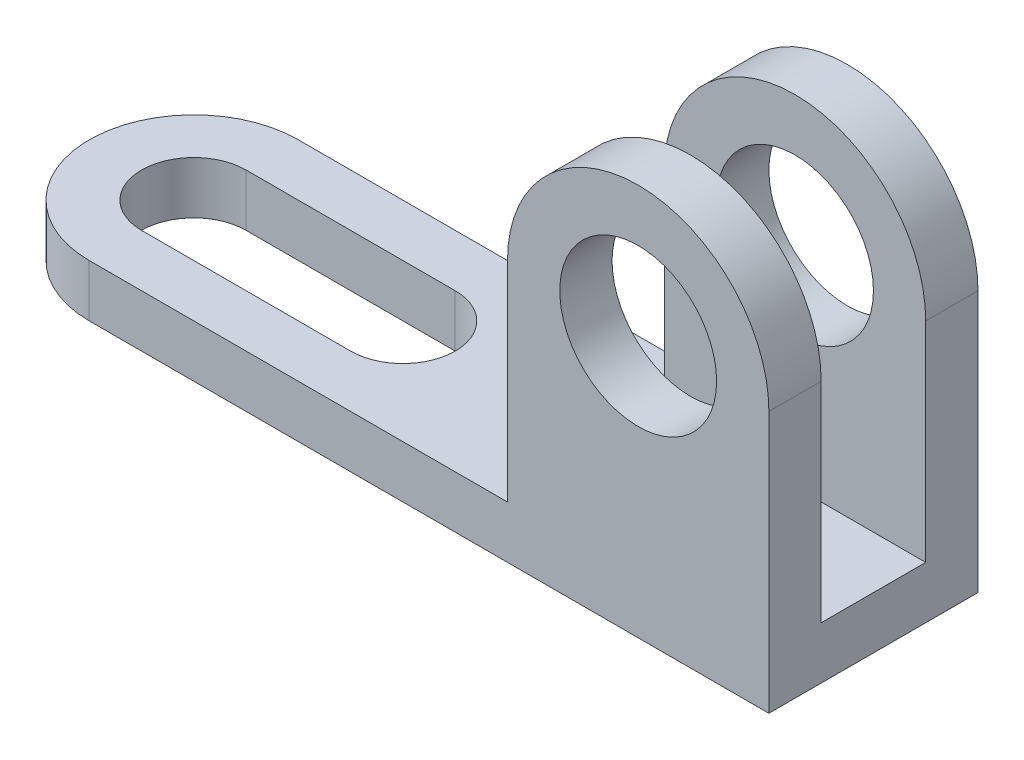
ISO-10303-21;
HEADER;
FILE_DESCRIPTION(('STEP AP214'),'2;1');
FILE_NAME('part.step','',(''),(''),'','','');
FILE_SCHEMA(('AUTOMOTIVE_DESIGN { 1 0 10303 214 1 1 1 1 }'));
ENDSEC;
DATA;
#1=APPLICATION_CONTEXT('core data for automotive mechanical design processes');
#2=APPLICATION_PROTOCOL_DEFINITION('international standard','automotive_design',2000,#1);
#3=PRODUCT_CONTEXT('',#1,'mechanical');
#4=PRODUCT('Part','Part','',(#3));
#5=PRODUCT_RELATED_PRODUCT_CATEGORY('part','',(#4));
#6=PRODUCT_DEFINITION_FORMATION('','',#4);
#7=PRODUCT_DEFINITION_CONTEXT('part definition',#1,'design');
#8=PRODUCT_DEFINITION('design','',#6,#7);
#9=PRODUCT_DEFINITION_SHAPE('','',#8);
#10=(LENGTH_UNIT() NAMED_UNIT(*) SI_UNIT(.MILLI.,.METRE.));
#11=(NAMED_UNIT(*) PLANE_ANGLE_UNIT() SI_UNIT($,.RADIAN.));
#12=(NAMED_UNIT(*) SI_UNIT($,.STERADIAN.) SOLID_ANGLE_UNIT());
#13=UNCERTAINTY_MEASURE_WITH_UNIT(LENGTH_MEASURE(1.E-05),#10,'distance_accuracy_value','');
#14=(GEOMETRIC_REPRESENTATION_CONTEXT(3) GLOBAL_UNCERTAINTY_ASSIGNED_CONTEXT((#13)) GLOBAL_UNIT_ASSIGNED_CONTEXT((#10,
#11,#12)) REPRESENTATION_CONTEXT('',''));
#15=CARTESIAN_POINT('',(0.,0.,0.));
#16=DIRECTION('',(0.,0.,1.));
#17=DIRECTION('',(1.,0.,0.));
#18=AXIS2_PLACEMENT_3D('',#15,#16,#17);
#19=CARTESIAN_POINT('',(0.,10.,-20.));
#20=DIRECTION('',(0.,0.,-1.));
#21=DIRECTION('',(-1.,0.,0.));
#22=AXIS2_PLACEMENT_3D('',#19,#20,#21);
#23=PLANE('',#22);
#24=CARTESIAN_POINT('',(40.,50.,-20.));
#25=DIRECTION('',(0.,0.,-1.));
#26=DIRECTION('',(-1.,0.,0.));
#27=AXIS2_PLACEMENT_3D('',#24,#25,#26);
#28=CIRCLE('',#27,15.);
#29=CARTESIAN_POINT('',(25.,50.,-20.));
#30=VERTEX_POINT('',#29);
#31=EDGE_CURVE('E343',#30,#30,#28,.F.);
#32=ORIENTED_EDGE('',*,*,#31,.T.);
#33=EDGE_LOOP('',(#32));
#34=FACE_BOUND('',#33,.T.);
#35=DIRECTION('',(0.,1.,0.));
#36=VECTOR('',#35,1.);
#37=CARTESIAN_POINT('',(15.,-50.9901951359279,-20.));
#38=LINE('',#37,#36);
#39=CARTESIAN_POINT('',(15.,10.,-20.));
#40=VERTEX_POINT('',#39);
#41=CARTESIAN_POINT('',(15.,50.,-20.));
#42=VERTEX_POINT('',#41);
#43=EDGE_CURVE('E165',#40,#42,#38,.T.);
#44=ORIENTED_EDGE('',*,*,#43,.T.);
#45=CARTESIAN_POINT('',(40.,50.,-20.));
#46=DIRECTION('',(0.,0.,-1.));
#47=DIRECTION('',(-1.,0.,0.));
#48=AXIS2_PLACEMENT_3D('',#45,#46,#47);
#49=CIRCLE('',#48,25.);
#50=CARTESIAN_POINT('',(65.,50.,-20.));
#51=VERTEX_POINT('',#50);
#52=EDGE_CURVE('E356',#42,#51,#49,.T.);
#53=ORIENTED_EDGE('',*,*,#52,.T.);
#54=DIRECTION('',(0.,1.,0.));
#55=VECTOR('',#54,1.);
#56=CARTESIAN_POINT('',(65.,-50.9901951359279,-20.));
#57=LINE('',#56,#55);
#58=CARTESIAN_POINT('',(65.,0.,-20.));
#59=VERTEX_POINT('',#58);
#60=EDGE_CURVE('E159',#59,#51,#57,.T.);
#61=ORIENTED_EDGE('',*,*,#60,.F.);
#62=DIRECTION('',(1.,0.,0.));
#63=VECTOR('',#62,1.);
#64=CARTESIAN_POINT('',(0.,0.,-20.));
#65=LINE('',#64,#63);
#66=CARTESIAN_POINT('',(-65.,0.,-20.));
#67=VERTEX_POINT('',#66);
#68=EDGE_CURVE('E244',#67,#59,#65,.T.);
#69=ORIENTED_EDGE('',*,*,#68,.F.);
#70=DIRECTION('',(0.,-1.,0.));
#71=VECTOR('',#70,1.);
#72=CARTESIAN_POINT('',(-65.,10.,-20.));
#73=LINE('',#72,#71);
#74=CARTESIAN_POINT('',(-65.,10.,-20.));
#75=VERTEX_POINT('',#74);
#76=EDGE_CURVE('E11',#75,#67,#73,.T.);
#77=ORIENTED_EDGE('',*,*,#76,.F.);
#78=DIRECTION('',(1.,0.,0.));
#79=VECTOR('',#78,1.);
#80=CARTESIAN_POINT('',(0.,10.,-20.));
#81=LINE('',#80,#79);
#82=EDGE_CURVE('E210',#75,#40,#81,.T.);
#83=ORIENTED_EDGE('',*,*,#82,.T.);
#84=EDGE_LOOP('',(#44,#53,#61,#69,#77,#83));
#85=FACE_BOUND('',#84,.T.);
#86=ADVANCED_FACE('F43',(#34,#85),#23,.T.);
#87=CARTESIAN_POINT('',(-65.,10.,0.));
#88=DIRECTION('',(0.,-1.,0.));
#89=DIRECTION('',(0.,0.,-1.));
#90=AXIS2_PLACEMENT_3D('',#87,#88,#89);
#91=CYLINDRICAL_SURFACE('',#90,20.);
#92=CARTESIAN_POINT('',(-65.,0.,0.));
#93=DIRECTION('',(0.,1.,0.));
#94=DIRECTION('',(0.,0.,1.));
#95=AXIS2_PLACEMENT_3D('',#92,#93,#94);
#96=CIRCLE('',#95,20.);
#97=CARTESIAN_POINT('',(-65.,0.,20.));
#98=VERTEX_POINT('',#97);
#99=EDGE_CURVE('E248',#67,#98,#96,.T.);
#100=ORIENTED_EDGE('',*,*,#99,.T.);
#101=DIRECTION('',(0.,-1.,0.));
#102=VECTOR('',#101,1.);
#103=CARTESIAN_POINT('',(-65.,10.,20.));
#104=LINE('',#103,#102);
#105=CARTESIAN_POINT('',(-65.,10.,20.));
#106=VERTEX_POINT('',#105);
#107=EDGE_CURVE('E54',#106,#98,#104,.T.);
#108=ORIENTED_EDGE('',*,*,#107,.F.);
#109=CARTESIAN_POINT('',(-65.,10.,0.));
#110=DIRECTION('',(0.,1.,0.));
#111=DIRECTION('',(0.,0.,1.));
#112=AXIS2_PLACEMENT_3D('',#109,#110,#111);
#113=CIRCLE('',#112,20.);
#114=EDGE_CURVE('E213',#75,#106,#113,.T.);
#115=ORIENTED_EDGE('',*,*,#114,.F.);
#116=ORIENTED_EDGE('',*,*,#76,.T.);
#117=EDGE_LOOP('',(#100,#108,#115,#116));
#118=FACE_BOUND('',#117,.T.);
#119=ADVANCED_FACE('F291',(#118),#91,.T.);
#120=CARTESIAN_POINT('',(0.,10.,20.));
#121=DIRECTION('',(0.,0.,-1.));
#122=DIRECTION('',(-1.,0.,0.));
#123=AXIS2_PLACEMENT_3D('',#120,#121,#122);
#124=PLANE('',#123);
#125=CARTESIAN_POINT('',(40.,50.,20.));
#126=DIRECTION('',(0.,0.,1.));
#127=DIRECTION('',(1.,0.,0.));
#128=AXIS2_PLACEMENT_3D('',#125,#126,#127);
#129=CIRCLE('',#128,15.);
#130=CARTESIAN_POINT('',(55.,50.,20.));
#131=VERTEX_POINT('',#130);
#132=EDGE_CURVE('E345',#131,#131,#129,.T.);
#133=ORIENTED_EDGE('',*,*,#132,.F.);
#134=EDGE_LOOP('',(#133));
#135=FACE_BOUND('',#134,.T.);
#136=DIRECTION('',(0.,1.,0.));
#137=VECTOR('',#136,1.);
#138=CARTESIAN_POINT('',(65.,-50.9901951359279,20.));
#139=LINE('',#138,#137);
#140=CARTESIAN_POINT('',(65.,0.,20.));
#141=VERTEX_POINT('',#140);
#142=CARTESIAN_POINT('',(65.,50.,20.));
#143=VERTEX_POINT('',#142);
#144=EDGE_CURVE('E179',#141,#143,#139,.T.);
#145=ORIENTED_EDGE('',*,*,#144,.T.);
#146=CARTESIAN_POINT('',(40.,50.,20.));
#147=DIRECTION('',(0.,0.,1.));
#148=DIRECTION('',(1.,0.,0.));
#149=AXIS2_PLACEMENT_3D('',#146,#147,#148);
#150=CIRCLE('',#149,25.);
#151=CARTESIAN_POINT('',(15.,50.,20.));
#152=VERTEX_POINT('',#151);
#153=EDGE_CURVE('E363',#143,#152,#150,.T.);
#154=ORIENTED_EDGE('',*,*,#153,.T.);
#155=DIRECTION('',(0.,1.,0.));
#156=VECTOR('',#155,1.);
#157=CARTESIAN_POINT('',(15.,-50.9901951359279,20.));
#158=LINE('',#157,#156);
#159=CARTESIAN_POINT('',(15.,10.,20.));
#160=VERTEX_POINT('',#159);
#161=EDGE_CURVE('E180',#160,#152,#158,.T.);
#162=ORIENTED_EDGE('',*,*,#161,.F.);
#163=DIRECTION('',(1.,0.,0.));
#164=VECTOR('',#163,1.);
#165=CARTESIAN_POINT('',(0.,10.,20.));
#166=LINE('',#165,#164);
#167=EDGE_CURVE('E217',#106,#160,#166,.T.);
#168=ORIENTED_EDGE('',*,*,#167,.F.);
#169=ORIENTED_EDGE('',*,*,#107,.T.);
#170=DIRECTION('',(1.,0.,0.));
#171=VECTOR('',#170,1.);
#172=CARTESIAN_POINT('',(0.,0.,20.));
#173=LINE('',#172,#171);
#174=EDGE_CURVE('E92',#98,#141,#173,.T.);
#175=ORIENTED_EDGE('',*,*,#174,.T.);
#176=EDGE_LOOP('',(#145,#154,#162,#168,#169,#175));
#177=FACE_BOUND('',#176,.T.);
#178=ADVANCED_FACE('F296',(#135,#177),#124,.F.);
#179=CARTESIAN_POINT('',(65.,10.,0.));
#180=DIRECTION('',(1.,0.,0.));
#181=DIRECTION('',(0.,0.,-1.));
#182=AXIS2_PLACEMENT_3D('',#179,#180,#181);
#183=PLANE('',#182);
#184=DIRECTION('',(0.,0.,1.));
#185=VECTOR('',#184,1.);
#186=CARTESIAN_POINT('',(65.,0.,0.));
#187=LINE('',#186,#185);
#188=EDGE_CURVE('E199',#59,#141,#187,.T.);
#189=ORIENTED_EDGE('',*,*,#188,.F.);
#190=ORIENTED_EDGE('',*,*,#60,.T.);
#191=DIRECTION('',(0.,0.,-1.));
#192=VECTOR('',#191,1.);
#193=CARTESIAN_POINT('',(65.,50.,-10.));
#194=LINE('',#193,#192);
#195=CARTESIAN_POINT('',(65.,50.,-10.));
#196=VERTEX_POINT('',#195);
#197=EDGE_CURVE('E156',#196,#51,#194,.T.);
#198=ORIENTED_EDGE('',*,*,#197,.F.);
#199=DIRECTION('',(0.,1.,0.));
#200=VECTOR('',#199,1.);
#201=CARTESIAN_POINT('',(65.,-50.9901951359279,-10.));
#202=LINE('',#201,#200);
#203=CARTESIAN_POINT('',(65.,10.,-10.));
#204=VERTEX_POINT('',#203);
#205=EDGE_CURVE('E146',#204,#196,#202,.T.);
#206=ORIENTED_EDGE('',*,*,#205,.F.);
#207=DIRECTION('',(0.,0.,1.));
#208=VECTOR('',#207,1.);
#209=CARTESIAN_POINT('',(65.,10.,0.));
#210=LINE('',#209,#208);
#211=CARTESIAN_POINT('',(65.,10.,10.));
#212=VERTEX_POINT('',#211);
#213=EDGE_CURVE('E128',#204,#212,#210,.T.);
#214=ORIENTED_EDGE('',*,*,#213,.T.);
#215=DIRECTION('',(0.,1.,0.));
#216=VECTOR('',#215,1.);
#217=CARTESIAN_POINT('',(65.,-50.9901951359279,10.));
#218=LINE('',#217,#216);
#219=CARTESIAN_POINT('',(65.,50.,10.));
#220=VERTEX_POINT('',#219);
#221=EDGE_CURVE('E189',#212,#220,#218,.T.);
#222=ORIENTED_EDGE('',*,*,#221,.T.);
#223=DIRECTION('',(0.,0.,-1.));
#224=VECTOR('',#223,1.);
#225=CARTESIAN_POINT('',(65.,50.,20.));
#226=LINE('',#225,#224);
#227=EDGE_CURVE('E163',#143,#220,#226,.T.);
#228=ORIENTED_EDGE('',*,*,#227,.F.);
#229=ORIENTED_EDGE('',*,*,#144,.F.);
#230=EDGE_LOOP('',(#189,#190,#198,#206,#214,#222,#228,#229));
#231=FACE_BOUND('',#230,.T.);
#232=ADVANCED_FACE('F153',(#231),#183,.T.);
#233=CARTESIAN_POINT('',(-65.,10.,0.));
#234=DIRECTION('',(0.,-1.,0.));
#235=DIRECTION('',(0.,0.,-1.));
#236=AXIS2_PLACEMENT_3D('',#233,#234,#235);
#237=CYLINDRICAL_SURFACE('',#236,10.);
#238=CARTESIAN_POINT('',(-65.,0.,0.));
#239=DIRECTION('',(0.,1.,0.));
#240=DIRECTION('',(0.,0.,1.));
#241=AXIS2_PLACEMENT_3D('',#238,#239,#240);
#242=CIRCLE('',#241,10.);
#243=CARTESIAN_POINT('',(-65.,0.,-9.99999999999999));
#244=VERTEX_POINT('',#243);
#245=CARTESIAN_POINT('',(-65.,0.,10.));
#246=VERTEX_POINT('',#245);
#247=EDGE_CURVE('E184',#244,#246,#242,.T.);
#248=ORIENTED_EDGE('',*,*,#247,.F.);
#249=DIRECTION('',(0.,-1.,0.));
#250=VECTOR('',#249,1.);
#251=CARTESIAN_POINT('',(-65.,10.,-9.99999999999999));
#252=LINE('',#251,#250);
#253=CARTESIAN_POINT('',(-65.,10.,-9.99999999999999));
#254=VERTEX_POINT('',#253);
#255=EDGE_CURVE('E100',#254,#244,#252,.T.);
#256=ORIENTED_EDGE('',*,*,#255,.F.);
#257=CARTESIAN_POINT('',(-65.,10.,0.));
#258=DIRECTION('',(0.,1.,0.));
#259=DIRECTION('',(0.,0.,1.));
#260=AXIS2_PLACEMENT_3D('',#257,#258,#259);
#261=CIRCLE('',#260,10.);
#262=CARTESIAN_POINT('',(-65.,10.,10.));
#263=VERTEX_POINT('',#262);
#264=EDGE_CURVE('E195',#254,#263,#261,.T.);
#265=ORIENTED_EDGE('',*,*,#264,.T.);
#266=DIRECTION('',(0.,-1.,0.));
#267=VECTOR('',#266,1.);
#268=CARTESIAN_POINT('',(-65.,10.,10.));
#269=LINE('',#268,#267);
#270=EDGE_CURVE('E228',#263,#246,#269,.T.);
#271=ORIENTED_EDGE('',*,*,#270,.T.);
#272=EDGE_LOOP('',(#248,#256,#265,#271));
#273=FACE_BOUND('',#272,.T.);
#274=ADVANCED_FACE('F45',(#273),#237,.F.);
#275=CARTESIAN_POINT('',(0.,10.,-10.));
#276=DIRECTION('',(0.,0.,1.));
#277=DIRECTION('',(1.,0.,0.));
#278=AXIS2_PLACEMENT_3D('',#275,#276,#277);
#279=PLANE('',#278);
#280=DIRECTION('',(-1.,0.,0.));
#281=VECTOR('',#280,1.);
#282=CARTESIAN_POINT('',(0.,0.,-10.));
#283=LINE('',#282,#281);
#284=CARTESIAN_POINT('',(-25.,0.,-10.));
#285=VERTEX_POINT('',#284);
#286=EDGE_CURVE('E232',#285,#244,#283,.T.);
#287=ORIENTED_EDGE('',*,*,#286,.F.);
#288=DIRECTION('',(0.,-1.,0.));
#289=VECTOR('',#288,1.);
#290=CARTESIAN_POINT('',(-25.,10.,-10.));
#291=LINE('',#290,#289);
#292=CARTESIAN_POINT('',(-25.,10.,-10.));
#293=VERTEX_POINT('',#292);
#294=EDGE_CURVE('E262',#293,#285,#291,.T.);
#295=ORIENTED_EDGE('',*,*,#294,.F.);
#296=DIRECTION('',(-1.,0.,0.));
#297=VECTOR('',#296,1.);
#298=CARTESIAN_POINT('',(0.,10.,-10.));
#299=LINE('',#298,#297);
#300=EDGE_CURVE('E198',#293,#254,#299,.T.);
#301=ORIENTED_EDGE('',*,*,#300,.T.);
#302=ORIENTED_EDGE('',*,*,#255,.T.);
#303=EDGE_LOOP('',(#287,#295,#301,#302));
#304=FACE_BOUND('',#303,.T.);
#305=ADVANCED_FACE('F267',(#304),#279,.T.);
#306=CARTESIAN_POINT('',(-25.,10.,0.));
#307=DIRECTION('',(0.,-1.,0.));
#308=DIRECTION('',(0.,0.,-1.));
#309=AXIS2_PLACEMENT_3D('',#306,#307,#308);
#310=CYLINDRICAL_SURFACE('',#309,10.);
#311=CARTESIAN_POINT('',(-25.,0.,0.));
#312=DIRECTION('',(0.,1.,0.));
#313=DIRECTION('',(0.,0.,1.));
#314=AXIS2_PLACEMENT_3D('',#311,#312,#313);
#315=CIRCLE('',#314,10.);
#316=CARTESIAN_POINT('',(-25.,0.,10.));
#317=VERTEX_POINT('',#316);
#318=EDGE_CURVE('E236',#317,#285,#315,.T.);
#319=ORIENTED_EDGE('',*,*,#318,.F.);
#320=DIRECTION('',(0.,-1.,0.));
#321=VECTOR('',#320,1.);
#322=CARTESIAN_POINT('',(-25.,10.,10.));
#323=LINE('',#322,#321);
#324=CARTESIAN_POINT('',(-25.,10.,10.));
#325=VERTEX_POINT('',#324);
#326=EDGE_CURVE('E259',#325,#317,#323,.T.);
#327=ORIENTED_EDGE('',*,*,#326,.F.);
#328=CARTESIAN_POINT('',(-25.,10.,0.));
#329=DIRECTION('',(0.,1.,0.));
#330=DIRECTION('',(0.,0.,1.));
#331=AXIS2_PLACEMENT_3D('',#328,#329,#330);
#332=CIRCLE('',#331,10.);
#333=EDGE_CURVE('E203',#325,#293,#332,.T.);
#334=ORIENTED_EDGE('',*,*,#333,.T.);
#335=ORIENTED_EDGE('',*,*,#294,.T.);
#336=EDGE_LOOP('',(#319,#327,#334,#335));
#337=FACE_BOUND('',#336,.T.);
#338=ADVANCED_FACE('F275',(#337),#310,.F.);
#339=CARTESIAN_POINT('',(0.,10.,9.99999999999999));
#340=DIRECTION('',(0.,0.,1.));
#341=DIRECTION('',(1.,0.,0.));
#342=AXIS2_PLACEMENT_3D('',#339,#340,#341);
#343=PLANE('',#342);
#344=DIRECTION('',(-1.,0.,0.));
#345=VECTOR('',#344,1.);
#346=CARTESIAN_POINT('',(0.,0.,9.99999999999999));
#347=LINE('',#346,#345);
#348=EDGE_CURVE('E240',#317,#246,#347,.T.);
#349=ORIENTED_EDGE('',*,*,#348,.T.);
#350=ORIENTED_EDGE('',*,*,#270,.F.);
#351=DIRECTION('',(-1.,0.,0.));
#352=VECTOR('',#351,1.);
#353=CARTESIAN_POINT('',(0.,10.,9.99999999999999));
#354=LINE('',#353,#352);
#355=EDGE_CURVE('E207',#325,#263,#354,.T.);
#356=ORIENTED_EDGE('',*,*,#355,.F.);
#357=ORIENTED_EDGE('',*,*,#326,.T.);
#358=EDGE_LOOP('',(#349,#350,#356,#357));
#359=FACE_BOUND('',#358,.T.);
#360=ADVANCED_FACE('F280',(#359),#343,.F.);
#361=CARTESIAN_POINT('',(0.,10.,0.));
#362=DIRECTION('',(0.,1.,0.));
#363=DIRECTION('',(0.,0.,1.));
#364=AXIS2_PLACEMENT_3D('',#361,#362,#363);
#365=PLANE('',#364);
#366=ORIENTED_EDGE('',*,*,#264,.F.);
#367=ORIENTED_EDGE('',*,*,#300,.F.);
#368=ORIENTED_EDGE('',*,*,#333,.F.);
#369=ORIENTED_EDGE('',*,*,#355,.T.);
#370=EDGE_LOOP('',(#366,#367,#368,#369));
#371=FACE_BOUND('',#370,.T.);
#372=ORIENTED_EDGE('',*,*,#82,.F.);
#373=ORIENTED_EDGE('',*,*,#114,.T.);
#374=ORIENTED_EDGE('',*,*,#167,.T.);
#375=DIRECTION('',(0.,0.,1.));
#376=VECTOR('',#375,1.);
#377=CARTESIAN_POINT('',(15.,10.,0.));
#378=LINE('',#377,#376);
#379=CARTESIAN_POINT('',(15.,10.,10.));
#380=VERTEX_POINT('',#379);
#381=EDGE_CURVE('E220',#380,#160,#378,.T.);
#382=ORIENTED_EDGE('',*,*,#381,.F.);
#383=DIRECTION('',(1.,0.,0.));
#384=VECTOR('',#383,1.);
#385=CARTESIAN_POINT('',(0.,10.,10.));
#386=LINE('',#385,#384);
#387=EDGE_CURVE('E133',#380,#212,#386,.T.);
#388=ORIENTED_EDGE('',*,*,#387,.T.);
#389=ORIENTED_EDGE('',*,*,#213,.F.);
#390=DIRECTION('',(1.,0.,0.));
#391=VECTOR('',#390,1.);
#392=CARTESIAN_POINT('',(0.,10.,-10.));
#393=LINE('',#392,#391);
#394=CARTESIAN_POINT('',(15.,10.,-10.));
#395=VERTEX_POINT('',#394);
#396=EDGE_CURVE('E131',#395,#204,#393,.T.);
#397=ORIENTED_EDGE('',*,*,#396,.F.);
#398=DIRECTION('',(0.,0.,-1.));
#399=VECTOR('',#398,1.);
#400=CARTESIAN_POINT('',(15.,10.,0.));
#401=LINE('',#400,#399);
#402=EDGE_CURVE('E63',#395,#40,#401,.T.);
#403=ORIENTED_EDGE('',*,*,#402,.T.);
#404=EDGE_LOOP('',(#372,#373,#374,#382,#388,#389,#397,#403));
#405=FACE_BOUND('',#404,.T.);
#406=ADVANCED_FACE('F130',(#371,#405),#365,.T.);
#407=CARTESIAN_POINT('',(0.,0.,0.));
#408=DIRECTION('',(0.,1.,0.));
#409=DIRECTION('',(0.,0.,1.));
#410=AXIS2_PLACEMENT_3D('',#407,#408,#409);
#411=PLANE('',#410);
#412=ORIENTED_EDGE('',*,*,#68,.T.);
#413=ORIENTED_EDGE('',*,*,#188,.T.);
#414=ORIENTED_EDGE('',*,*,#174,.F.);
#415=ORIENTED_EDGE('',*,*,#99,.F.);
#416=EDGE_LOOP('',(#412,#413,#414,#415));
#417=FACE_BOUND('',#416,.T.);
#418=ORIENTED_EDGE('',*,*,#247,.T.);
#419=ORIENTED_EDGE('',*,*,#348,.F.);
#420=ORIENTED_EDGE('',*,*,#318,.T.);
#421=ORIENTED_EDGE('',*,*,#286,.T.);
#422=EDGE_LOOP('',(#418,#419,#420,#421));
#423=FACE_BOUND('',#422,.T.);
#424=ADVANCED_FACE('F272',(#417,#423),#411,.F.);
#425=CARTESIAN_POINT('',(15.,-50.9901951359279,20.));
#426=DIRECTION('',(-1.,0.,0.));
#427=DIRECTION('',(0.,0.,1.));
#428=AXIS2_PLACEMENT_3D('',#425,#426,#427);
#429=PLANE('',#428);
#430=DIRECTION('',(0.,1.,0.));
#431=VECTOR('',#430,1.);
#432=CARTESIAN_POINT('',(15.,-50.9901951359279,10.));
#433=LINE('',#432,#431);
#434=CARTESIAN_POINT('',(15.,50.,10.));
#435=VERTEX_POINT('',#434);
#436=EDGE_CURVE('E185',#380,#435,#433,.T.);
#437=ORIENTED_EDGE('',*,*,#436,.F.);
#438=ORIENTED_EDGE('',*,*,#381,.T.);
#439=ORIENTED_EDGE('',*,*,#161,.T.);
#440=DIRECTION('',(0.,0.,1.));
#441=VECTOR('',#440,1.);
#442=CARTESIAN_POINT('',(15.,50.,20.));
#443=LINE('',#442,#441);
#444=EDGE_CURVE('E175',#435,#152,#443,.T.);
#445=ORIENTED_EDGE('',*,*,#444,.F.);
#446=EDGE_LOOP('',(#437,#438,#439,#445));
#447=FACE_BOUND('',#446,.T.);
#448=ADVANCED_FACE('F307',(#447),#429,.T.);
#449=CARTESIAN_POINT('',(15.,-50.9901951359279,10.));
#450=DIRECTION('',(0.,0.,-1.));
#451=DIRECTION('',(-1.,0.,0.));
#452=AXIS2_PLACEMENT_3D('',#449,#450,#451);
#453=PLANE('',#452);
#454=CARTESIAN_POINT('',(40.,50.,10.));
#455=DIRECTION('',(0.,0.,-1.));
#456=DIRECTION('',(-1.,0.,0.));
#457=AXIS2_PLACEMENT_3D('',#454,#455,#456);
#458=CIRCLE('',#457,15.);
#459=CARTESIAN_POINT('',(25.,50.,10.));
#460=VERTEX_POINT('',#459);
#461=EDGE_CURVE('E349',#460,#460,#458,.T.);
#462=ORIENTED_EDGE('',*,*,#461,.F.);
#463=EDGE_LOOP('',(#462));
#464=FACE_BOUND('',#463,.T.);
#465=ORIENTED_EDGE('',*,*,#436,.T.);
#466=CARTESIAN_POINT('',(40.,50.,10.));
#467=DIRECTION('',(0.,0.,-1.));
#468=DIRECTION('',(-1.,0.,0.));
#469=AXIS2_PLACEMENT_3D('',#466,#467,#468);
#470=CIRCLE('',#469,25.);
#471=EDGE_CURVE('E367',#220,#435,#470,.F.);
#472=ORIENTED_EDGE('',*,*,#471,.F.);
#473=ORIENTED_EDGE('',*,*,#221,.F.);
#474=ORIENTED_EDGE('',*,*,#387,.F.);
#475=EDGE_LOOP('',(#465,#472,#473,#474));
#476=FACE_BOUND('',#475,.T.);
#477=ADVANCED_FACE('F309',(#464,#476),#453,.T.);
#478=CARTESIAN_POINT('',(15.,-50.9901951359279,-10.));
#479=DIRECTION('',(0.,0.,1.));
#480=DIRECTION('',(1.,0.,0.));
#481=AXIS2_PLACEMENT_3D('',#478,#479,#480);
#482=PLANE('',#481);
#483=CARTESIAN_POINT('',(40.,50.,-10.));
#484=DIRECTION('',(0.,0.,1.));
#485=DIRECTION('',(1.,0.,0.));
#486=AXIS2_PLACEMENT_3D('',#483,#484,#485);
#487=CIRCLE('',#486,15.);
#488=CARTESIAN_POINT('',(55.,50.,-10.));
#489=VERTEX_POINT('',#488);
#490=EDGE_CURVE('E47',#489,#489,#487,.T.);
#491=ORIENTED_EDGE('',*,*,#490,.F.);
#492=EDGE_LOOP('',(#491));
#493=FACE_BOUND('',#492,.T.);
#494=ORIENTED_EDGE('',*,*,#205,.T.);
#495=CARTESIAN_POINT('',(40.,50.,-10.));
#496=DIRECTION('',(0.,0.,1.));
#497=DIRECTION('',(1.,0.,0.));
#498=AXIS2_PLACEMENT_3D('',#495,#496,#497);
#499=CIRCLE('',#498,25.);
#500=CARTESIAN_POINT('',(15.,50.,-10.));
#501=VERTEX_POINT('',#500);
#502=EDGE_CURVE('E360',#501,#196,#499,.F.);
#503=ORIENTED_EDGE('',*,*,#502,.F.);
#504=DIRECTION('',(0.,1.,0.));
#505=VECTOR('',#504,1.);
#506=CARTESIAN_POINT('',(15.,-50.9901951359279,-10.));
#507=LINE('',#506,#505);
#508=EDGE_CURVE('E149',#395,#501,#507,.T.);
#509=ORIENTED_EDGE('',*,*,#508,.F.);
#510=ORIENTED_EDGE('',*,*,#396,.T.);
#511=EDGE_LOOP('',(#494,#503,#509,#510));
#512=FACE_BOUND('',#511,.T.);
#513=ADVANCED_FACE('F143',(#493,#512),#482,.T.);
#514=CARTESIAN_POINT('',(15.,-50.9901951359279,-20.));
#515=DIRECTION('',(-1.,0.,0.));
#516=DIRECTION('',(0.,0.,1.));
#517=AXIS2_PLACEMENT_3D('',#514,#515,#516);
#518=PLANE('',#517);
#519=ORIENTED_EDGE('',*,*,#43,.F.);
#520=ORIENTED_EDGE('',*,*,#402,.F.);
#521=ORIENTED_EDGE('',*,*,#508,.T.);
#522=DIRECTION('',(0.,0.,1.));
#523=VECTOR('',#522,1.);
#524=CARTESIAN_POINT('',(15.,50.,-20.));
#525=LINE('',#524,#523);
#526=EDGE_CURVE('E371',#42,#501,#525,.T.);
#527=ORIENTED_EDGE('',*,*,#526,.F.);
#528=EDGE_LOOP('',(#519,#520,#521,#527));
#529=FACE_BOUND('',#528,.T.);
#530=ADVANCED_FACE('F316',(#529),#518,.T.);
#531=CARTESIAN_POINT('',(40.,50.,-60.7106781186548));
#532=DIRECTION('',(0.,0.,1.));
#533=DIRECTION('',(1.,0.,0.));
#534=AXIS2_PLACEMENT_3D('',#531,#532,#533);
#535=CYLINDRICAL_SURFACE('',#534,25.);
#536=ORIENTED_EDGE('',*,*,#471,.T.);
#537=ORIENTED_EDGE('',*,*,#444,.T.);
#538=ORIENTED_EDGE('',*,*,#153,.F.);
#539=ORIENTED_EDGE('',*,*,#227,.T.);
#540=EDGE_LOOP('',(#536,#537,#538,#539));
#541=FACE_BOUND('',#540,.T.);
#542=ADVANCED_FACE('F319',(#541),#535,.T.);
#543=CARTESIAN_POINT('',(40.,50.,60.7106781186548));
#544=DIRECTION('',(0.,0.,-1.));
#545=DIRECTION('',(-1.,0.,0.));
#546=AXIS2_PLACEMENT_3D('',#543,#544,#545);
#547=CYLINDRICAL_SURFACE('',#546,25.);
#548=ORIENTED_EDGE('',*,*,#502,.T.);
#549=ORIENTED_EDGE('',*,*,#197,.T.);
#550=ORIENTED_EDGE('',*,*,#52,.F.);
#551=ORIENTED_EDGE('',*,*,#526,.T.);
#552=EDGE_LOOP('',(#548,#549,#550,#551));
#553=FACE_BOUND('',#552,.T.);
#554=ADVANCED_FACE('F326',(#553),#547,.T.);
#555=CARTESIAN_POINT('',(40.,50.,-62.4264068711929));
#556=DIRECTION('',(0.,0.,1.));
#557=DIRECTION('',(1.,0.,0.));
#558=AXIS2_PLACEMENT_3D('',#555,#556,#557);
#559=CYLINDRICAL_SURFACE('',#558,15.);
#560=ORIENTED_EDGE('',*,*,#490,.T.);
#561=EDGE_LOOP('',(#560));
#562=FACE_BOUND('',#561,.T.);
#563=ORIENTED_EDGE('',*,*,#31,.F.);
#564=EDGE_LOOP('',(#563));
#565=FACE_BOUND('',#564,.T.);
#566=ADVANCED_FACE('F330',(#562,#565),#559,.F.);
#567=ORIENTED_EDGE('',*,*,#461,.T.);
#568=EDGE_LOOP('',(#567));
#569=FACE_BOUND('',#568,.T.);
#570=ORIENTED_EDGE('',*,*,#132,.T.);
#571=EDGE_LOOP('',(#570));
#572=FACE_BOUND('',#571,.T.);
#573=ADVANCED_FACE('F333',(#569,#572),#559,.F.);
#574=CLOSED_SHELL('',(#86,#119,#178,#232,#274,#305,#338,#360,#406,#424,#448,#477,#513,#530,#542,
#554,#566,#573));
#575=MANIFOLD_SOLID_BREP('B2',#574);
#576=ADVANCED_BREP_SHAPE_REPRESENTATION('',(#18,#575),#14);
#577=SHAPE_DEFINITION_REPRESENTATION(#9,#576);
ENDSEC;
END-ISO-10303-21;
